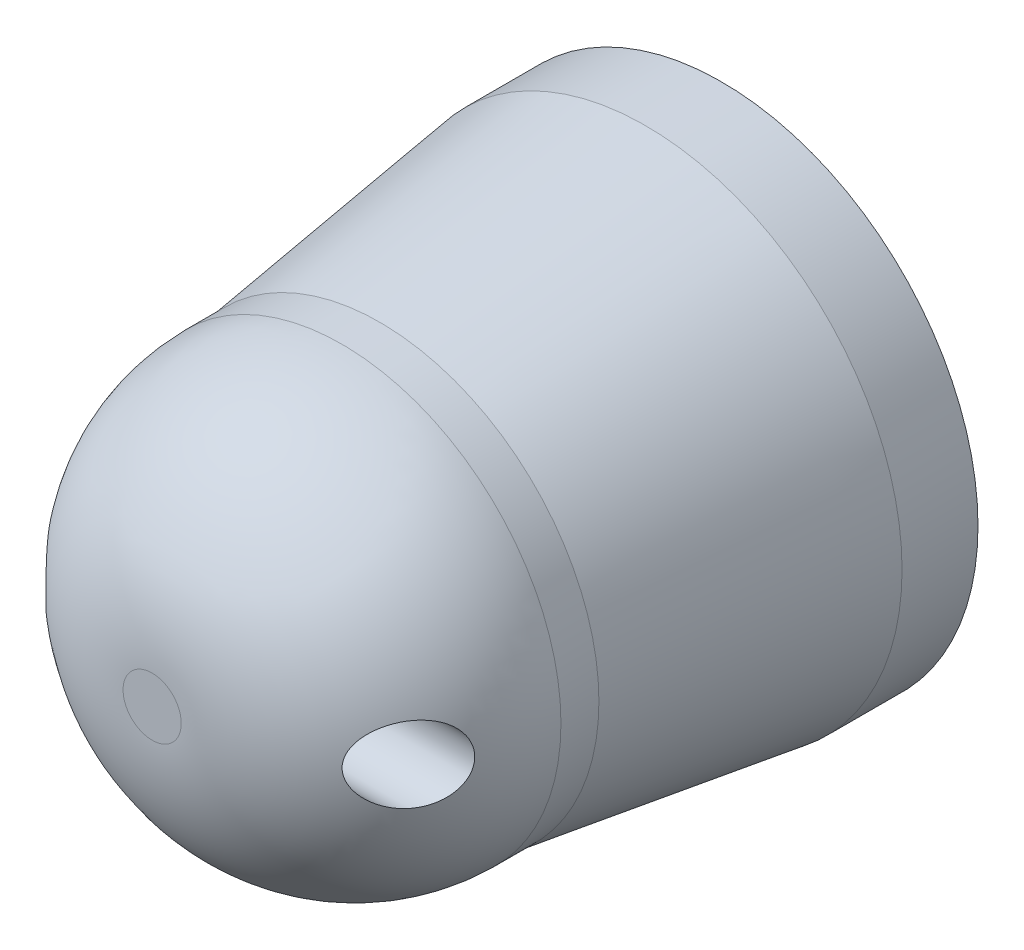
ISO-10303-21;
HEADER;
FILE_DESCRIPTION(('STEP AP214'),'2;1');
FILE_NAME('part.step','',(''),(''),'','','');
FILE_SCHEMA(('AUTOMOTIVE_DESIGN { 1 0 10303 214 1 1 1 1 }'));
ENDSEC;
DATA;
#1=APPLICATION_CONTEXT('core data for automotive mechanical design processes');
#2=APPLICATION_PROTOCOL_DEFINITION('international standard','automotive_design',2000,#1);
#3=PRODUCT_CONTEXT('',#1,'mechanical');
#4=PRODUCT('Part','Part','',(#3));
#5=PRODUCT_RELATED_PRODUCT_CATEGORY('part','',(#4));
#6=PRODUCT_DEFINITION_FORMATION('','',#4);
#7=PRODUCT_DEFINITION_CONTEXT('part definition',#1,'design');
#8=PRODUCT_DEFINITION('design','',#6,#7);
#9=PRODUCT_DEFINITION_SHAPE('','',#8);
#10=(LENGTH_UNIT() NAMED_UNIT(*) SI_UNIT(.MILLI.,.METRE.));
#11=(NAMED_UNIT(*) PLANE_ANGLE_UNIT() SI_UNIT($,.RADIAN.));
#12=(NAMED_UNIT(*) SI_UNIT($,.STERADIAN.) SOLID_ANGLE_UNIT());
#13=UNCERTAINTY_MEASURE_WITH_UNIT(LENGTH_MEASURE(1.E-05),#10,'distance_accuracy_value','');
#14=(GEOMETRIC_REPRESENTATION_CONTEXT(3) GLOBAL_UNCERTAINTY_ASSIGNED_CONTEXT((#13)) GLOBAL_UNIT_ASSIGNED_CONTEXT((#10,
#11,#12)) REPRESENTATION_CONTEXT('',''));
#15=CARTESIAN_POINT('',(0.,0.,0.));
#16=DIRECTION('',(0.,0.,1.));
#17=DIRECTION('',(1.,0.,0.));
#18=AXIS2_PLACEMENT_3D('',#15,#16,#17);
#19=CARTESIAN_POINT('',(0.,0.,-5.00000000000141));
#20=DIRECTION('',(0.,0.,1.));
#21=DIRECTION('',(1.,0.,0.));
#22=AXIS2_PLACEMENT_3D('',#19,#20,#21);
#23=DEGENERATE_TOROIDAL_SURFACE('',#22,0.766214157083196,5.,.T.);
#24=CARTESIAN_POINT('',(0.,0.,-1.41015809100517E-12));
#25=DIRECTION('',(0.,0.,1.));
#26=DIRECTION('',(1.,0.,0.));
#27=AXIS2_PLACEMENT_3D('',#24,#25,#26);
#28=CIRCLE('',#27,0.766214157083159);
#29=CARTESIAN_POINT('',(0.766214157083159,0.,-1.41015809100517E-12));
#30=VERTEX_POINT('',#29);
#31=EDGE_CURVE('E11',#30,#30,#28,.T.);
#32=ORIENTED_EDGE('',*,*,#31,.F.);
#33=EDGE_LOOP('',(#32));
#34=FACE_BOUND('',#33,.T.);
#35=CARTESIAN_POINT('',(0.,0.,-5.00000000000145));
#36=DIRECTION('',(0.,0.,1.));
#37=DIRECTION('',(1.,0.,0.));
#38=AXIS2_PLACEMENT_3D('',#35,#36,#37);
#39=CIRCLE('',#38,5.7662141570832);
#40=CARTESIAN_POINT('',(5.7662141570832,0.,-5.00000000000145));
#41=VERTEX_POINT('',#40);
#42=EDGE_CURVE('E57',#41,#41,#39,.T.);
#43=ORIENTED_EDGE('',*,*,#42,.T.);
#44=EDGE_LOOP('',(#43));
#45=FACE_BOUND('',#44,.T.);
#46=CARTESIAN_POINT('',(3.91551272438864,-0.181596850380828,-1.11987230926239));
#47=CARTESIAN_POINT('',(3.92464958219834,-0.232052576347552,-1.12919032917543));
#48=CARTESIAN_POINT('',(3.93745329032416,-0.28113390884847,-1.14229610931165));
#49=CARTESIAN_POINT('',(3.96894261741013,-0.375086726060637,-1.17491580366691));
#50=CARTESIAN_POINT('',(3.98763773472675,-0.419951259568574,-1.19444006822477));
#51=CARTESIAN_POINT('',(4.02915440916165,-0.504307011253518,-1.23842532676238));
#52=CARTESIAN_POINT('',(4.05192925883742,-0.543850990603123,-1.26283077253618));
#53=CARTESIAN_POINT('',(4.10052414868939,-0.617963056177003,-1.31572013503896));
#54=CARTESIAN_POINT('',(4.12634442595687,-0.652530754524231,-1.34420436934498));
#55=CARTESIAN_POINT('',(4.19389749641283,-0.733186687574791,-1.41996299808042));
#56=CARTESIAN_POINT('',(4.23700895794421,-0.776111928470118,-1.46939107303642));
#57=CARTESIAN_POINT('',(4.32587768552665,-0.850874149239611,-1.5739503598945));
#58=CARTESIAN_POINT('',(4.37163916150832,-0.882692888255067,-1.62909076271542));
#59=CARTESIAN_POINT('',(4.4648514932579,-0.935526914236205,-1.74428698053561));
#60=CARTESIAN_POINT('',(4.51231633664908,-0.956401746647023,-1.80439575649337));
#61=CARTESIAN_POINT('',(4.60717628427467,-0.986475802080964,-1.92751430143365));
#62=CARTESIAN_POINT('',(4.65457138356468,-0.995674233725975,-1.99052426674689));
#63=CARTESIAN_POINT('',(4.75313059880456,-1.00224980795107,-2.12462470586105));
#64=CARTESIAN_POINT('',(4.80417507015434,-0.998300311369112,-2.19587486396546));
#65=CARTESIAN_POINT('',(4.90346729239999,-0.97476347150355,-2.33775397725687));
#66=CARTESIAN_POINT('',(4.95171774113192,-0.955191492339454,-2.40838347387825));
#67=CARTESIAN_POINT('',(5.03311939194765,-0.906152158676146,-2.53001902544232));
#68=CARTESIAN_POINT('',(5.06717617963064,-0.880035033977753,-2.5817754218384));
#69=CARTESIAN_POINT('',(5.13185873401814,-0.817988317448195,-2.68146349903377));
#70=CARTESIAN_POINT('',(5.1624857698745,-0.782062372323847,-2.72939659271341));
#71=CARTESIAN_POINT('',(5.21955174567754,-0.700237229783592,-2.81977360855209));
#72=CARTESIAN_POINT('',(5.24595498963175,-0.654260081574043,-2.86217024055878));
#73=CARTESIAN_POINT('',(5.29312231899418,-0.553308072965033,-2.93861633171162));
#74=CARTESIAN_POINT('',(5.31389203861397,-0.49834229116812,-2.97267412736838));
#75=CARTESIAN_POINT('',(5.34614898526469,-0.389645829924935,-3.0259006058258));
#76=CARTESIAN_POINT('',(5.3585454122495,-0.336891363844607,-3.04651202470234));
#77=CARTESIAN_POINT('',(5.37780078982728,-0.227731520184067,-3.07862434344694));
#78=CARTESIAN_POINT('',(5.38466532161478,-0.171329884513418,-3.09013442554049));
#79=CARTESIAN_POINT('',(5.39200817254014,-0.0641928439132546,-3.10245291629684));
#80=CARTESIAN_POINT('',(5.39317994910689,-0.0136348596198455,-3.1044232756151));
#81=CARTESIAN_POINT('',(5.39097352621097,0.0870916245190146,-3.10071804297531));
#82=CARTESIAN_POINT('',(5.38759673173877,0.137260239821665,-3.0950448120161));
#83=CARTESIAN_POINT('',(5.37665768406311,0.233773984856216,-3.07672891437822));
#84=CARTESIAN_POINT('',(5.36926296837412,0.280191939069416,-3.06436529940116));
#85=CARTESIAN_POINT('',(5.3506827324677,0.370105068441291,-3.03345138567398));
#86=CARTESIAN_POINT('',(5.33949678920689,0.413599916776476,-3.01490039651062));
#87=CARTESIAN_POINT('',(5.31311002297553,0.498658279157996,-2.97141888597494));
#88=CARTESIAN_POINT('',(5.29774844299611,0.540041428898376,-2.94623456380394));
#89=CARTESIAN_POINT('',(5.26375825408568,0.61788401526582,-2.89096421017212));
#90=CARTESIAN_POINT('',(5.24512847526049,0.654341680451569,-2.86087642372743));
#91=CARTESIAN_POINT('',(5.20288000265725,0.72561006776314,-2.79328804078525));
#92=CARTESIAN_POINT('',(5.17893807031974,0.759799806059739,-2.7553362061633));
#93=CARTESIAN_POINT('',(5.12824159672882,0.821315494844422,-2.67592978961033));
#94=CARTESIAN_POINT('',(5.101485655601,0.848638005990838,-2.63447346634599));
#95=CARTESIAN_POINT('',(5.04153814557387,0.899969144545144,-2.54280367271123));
#96=CARTESIAN_POINT('',(5.00798274269226,0.922869555542728,-2.49220824269589));
#97=CARTESIAN_POINT('',(4.93863076908344,0.959757428413421,-2.38934964487398));
#98=CARTESIAN_POINT('',(4.90283302670779,0.973740187319699,-2.33708561231489));
#99=CARTESIAN_POINT('',(4.82379766130931,0.994644577473659,-2.22371222728919));
#100=CARTESIAN_POINT('',(4.78028386700545,1.00008485332095,-2.16252123574102));
#101=CARTESIAN_POINT('',(4.6920061548602,0.999913007285519,-2.04104297157383));
#102=CARTESIAN_POINT('',(4.64724129702911,0.994292341968491,-1.9807564337933));
#103=CARTESIAN_POINT('',(4.55167138774703,0.97104691792896,-1.85492496645013));
#104=CARTESIAN_POINT('',(4.50081741921579,0.951995933976108,-1.78967735504654));
#105=CARTESIAN_POINT('',(4.40003953567115,0.900793954103438,-1.66370673732055));
#106=CARTESIAN_POINT('',(4.35011567018882,0.868642262601006,-1.60298397144755));
#107=CARTESIAN_POINT('',(4.26136236457079,0.797942932683092,-1.49777915782112));
#108=CARTESIAN_POINT('',(4.22209611504997,0.761430641799014,-1.45229593062562));
#109=CARTESIAN_POINT('',(4.14696885446376,0.679335300747038,-1.36704178773326));
#110=CARTESIAN_POINT('',(4.11110278483506,0.633766047953034,-1.32726233966233));
#111=CARTESIAN_POINT('',(4.05346372306417,0.546421221035608,-1.26448080580738));
#112=CARTESIAN_POINT('',(4.03043870628137,0.506684891433534,-1.23979515782175));
#113=CARTESIAN_POINT('',(3.98871308457407,0.422355722558621,-1.19557064807802));
#114=CARTESIAN_POINT('',(3.97000639943102,0.377769843297826,-1.17602454436958));
#115=CARTESIAN_POINT('',(3.94117489475664,0.292613265464853,-1.14614603209781));
#116=CARTESIAN_POINT('',(3.93011884759828,0.25271861342167,-1.13479714894787));
#117=CARTESIAN_POINT('',(3.9127679053576,0.170839803400439,-1.11705852447406));
#118=CARTESIAN_POINT('',(3.90646943207423,0.128857241133992,-1.11066505605713));
#119=CARTESIAN_POINT('',(3.8990237768751,0.0417127929966873,-1.10311134045884));
#120=CARTESIAN_POINT('',(3.89816362503249,-0.00350045560364973,-1.10224267427866));
#121=CARTESIAN_POINT('',(3.90245773199322,-0.0933505706559028,-1.10659447880612));
#122=CARTESIAN_POINT('',(3.90761557718667,-0.13798707736686,-1.11181858046231));
#123=CARTESIAN_POINT('',(3.91551272438864,-0.181596850380828,-1.11987230926239));
#124=B_SPLINE_CURVE_WITH_KNOTS('',3,(#46,#47,#48,#49,#50,#51,#52,#53,#54,#55,#56,#57,#58,#59,
#60,#61,#62,#63,#64,#65,#66,#67,#68,#69,#70,#71,#72,#73,#74,#75,#76,#77,#78,#79,#80,#81,#82,#83,
#84,#85,#86,#87,#88,#89,#90,#91,#92,#93,#94,#95,#96,#97,#98,#99,#100,#101,#102,#103,#104,#105,
#106,#107,#108,#109,#110,#111,#112,#113,#114,#115,#116,#117,#118,#119,#120,#121,#122,#123),
.UNSPECIFIED.,.T.,.F.,(4,2,2,2,2,2,2,2,2,2,2,2,2,2,2,2,2,2,2,2,2,2,2,2,2,2,2,2,2,2,2,2,2,2,2,2,
2,2,4),(0.,0.156120278331717,0.312493558736575,0.467179343790239,0.621877179332349,
0.855778970080472,1.09006312366256,1.32728471017928,1.56452237373495,1.82639362416755,
2.08800765099445,2.28891260414643,2.48974296666004,2.69218988968779,2.89443358821342,
3.06735679698028,3.24010532228277,3.39116998694618,3.54218800052958,3.68734454053628,
3.83251728314218,3.98435543153194,4.13624804367788,4.30482813020148,4.47349247989338,
4.66740335993518,4.86141641978315,5.08636413285264,5.31148566298706,5.56503509399123,
5.81859798896757,6.02877986529623,6.23864397150079,6.39452580916921,6.55018680770701,
6.67842980852656,6.80657626068162,6.94143335981401,7.07637086731145),.UNSPECIFIED.);
#125=CARTESIAN_POINT('',(3.91551272438864,-0.181596850380828,-1.11987230926239));
#126=VERTEX_POINT('',#125);
#127=EDGE_CURVE('E86',#126,#126,#124,.T.);
#128=ORIENTED_EDGE('',*,*,#127,.F.);
#129=EDGE_LOOP('',(#128));
#130=FACE_BOUND('',#129,.T.);
#131=CARTESIAN_POINT('',(-5.24198639971323,-0.658395880390246,-2.85591737944631));
#132=CARTESIAN_POINT('',(-5.21690237769717,-0.704494715094463,-2.81558933806743));
#133=CARTESIAN_POINT('',(-5.18931144880955,-0.74612352907558,-2.77167779939897));
#134=CARTESIAN_POINT('',(-5.13014906680513,-0.819888440939242,-2.67884129971001));
#135=CARTESIAN_POINT('',(-5.09857209957124,-0.852011178600024,-2.62990941165133));
#136=CARTESIAN_POINT('',(-5.03257717636381,-0.906523270691957,-2.52923905587878));
#137=CARTESIAN_POINT('',(-4.99817847559906,-0.92897296901005,-2.47752032132827));
#138=CARTESIAN_POINT('',(-4.92715290443993,-0.964657710568012,-2.37252527893781));
#139=CARTESIAN_POINT('',(-4.89052645878891,-0.977894504395413,-2.31924926900893));
#140=CARTESIAN_POINT('',(-4.81015850424683,-0.996807707936884,-2.20444039236183));
#141=CARTESIAN_POINT('',(-4.76616567138344,-1.00107697017665,-2.14285133849897));
#142=CARTESIAN_POINT('',(-4.67700168923358,-0.998462730751191,-2.02073261496012));
#143=CARTESIAN_POINT('',(-4.63182947353697,-0.991568765502057,-1.96020399302104));
#144=CARTESIAN_POINT('',(-4.53562848261413,-0.965533596953492,-1.83421074423376));
#145=CARTESIAN_POINT('',(-4.48456540061573,-0.944985007434937,-1.76905971921438));
#146=CARTESIAN_POINT('',(-4.38355260174766,-0.89068960085531,-1.64351747095817));
#147=CARTESIAN_POINT('',(-4.33360278935498,-0.856943920801923,-1.58312583820988));
#148=CARTESIAN_POINT('',(-4.24598534318867,-0.783981684738796,-1.47988824438433));
#149=CARTESIAN_POINT('',(-4.2077887497831,-0.747026813157477,-1.43588992711651));
#150=CARTESIAN_POINT('',(-4.13488392120522,-0.664365149918707,-1.35357126724126));
#151=CARTESIAN_POINT('',(-4.10017038219015,-0.61867198267333,-1.315242248135));
#152=CARTESIAN_POINT('',(-4.04447957186805,-0.531251976991193,-1.25481532266474));
#153=CARTESIAN_POINT('',(-4.02225274752858,-0.49146504023984,-1.23106744916549));
#154=CARTESIAN_POINT('',(-3.98216287385508,-0.407216911217147,-1.18870262311434));
#155=CARTESIAN_POINT('',(-3.96429377924404,-0.362762318143163,-1.17007855788799));
#156=CARTESIAN_POINT('',(-3.93689863038335,-0.277790645329436,-1.14174559233597));
#157=CARTESIAN_POINT('',(-3.92646950268263,-0.237894745809948,-1.13105801233812));
#158=CARTESIAN_POINT('',(-3.91038735779462,-0.156161496605778,-1.11463705882081));
#159=CARTESIAN_POINT('',(-3.90473069694564,-0.114325653812925,-1.10889990569529));
#160=CARTESIAN_POINT('',(-3.89870039279673,-0.029725181098875,-1.10278524406755));
#161=CARTESIAN_POINT('',(-3.89834549080874,0.0130422087188751,-1.10242674868961));
#162=CARTESIAN_POINT('',(-3.9030034981587,0.0979786582364521,-1.10714778434644));
#163=CARTESIAN_POINT('',(-3.90801750361966,0.140147593973839,-1.11222842584229));
#164=CARTESIAN_POINT('',(-3.92255435718664,0.220538056262535,-1.12705361170132));
#165=CARTESIAN_POINT('',(-3.93183535104621,0.258851297346071,-1.13654825712624));
#166=CARTESIAN_POINT('',(-3.95413425650728,0.333093577392365,-1.15954952876703));
#167=CARTESIAN_POINT('',(-3.96715388221183,0.369021513406835,-1.17305799535482));
#168=CARTESIAN_POINT('',(-4.00255010354744,0.453126427439144,-1.21015489379858));
#169=CARTESIAN_POINT('',(-4.02653231829815,0.499823417993634,-1.23557110092858));
#170=CARTESIAN_POINT('',(-4.07885505932987,0.587005149692982,-1.2919903109494));
#171=CARTESIAN_POINT('',(-4.10720544772145,0.627475408797004,-1.32300598377143));
#172=CARTESIAN_POINT('',(-4.17627167956522,0.71396527533812,-1.39997990633698));
#173=CARTESIAN_POINT('',(-4.21806020031601,0.75768341952604,-1.44755967482659));
#174=CARTESIAN_POINT('',(-4.30441874287632,0.834374097536968,-1.54841346965963));
#175=CARTESIAN_POINT('',(-4.3489903336528,0.867340503654967,-1.60169072026478));
#176=CARTESIAN_POINT('',(-4.4401451104704,0.923025263260758,-1.71340151939811));
#177=CARTESIAN_POINT('',(-4.48674912796413,0.945570113759509,-1.77190426340998));
#178=CARTESIAN_POINT('',(-4.58009786697488,0.97941802670822,-1.89198104761208));
#179=CARTESIAN_POINT('',(-4.62684262577641,0.990717787507724,-1.95355598425392));
#180=CARTESIAN_POINT('',(-4.72503741685018,1.00231132447035,-2.08592724493));
#181=CARTESIAN_POINT('',(-4.77637783649678,1.00111930775162,-2.15694249947711));
#182=CARTESIAN_POINT('',(-4.8765378723104,0.983285028349151,-2.29882610252821));
#183=CARTESIAN_POINT('',(-4.9253595813173,0.966655818287753,-2.36969452445473));
#184=CARTESIAN_POINT('',(-5.00878714307667,0.922563846032096,-2.49338002002239));
#185=CARTESIAN_POINT('',(-5.04418207129001,0.898226710026782,-2.54678294809184));
#186=CARTESIAN_POINT('',(-5.11161572583334,0.839371968595222,-2.65003644959743));
#187=CARTESIAN_POINT('',(-5.14365556428998,0.80485775117978,-2.6998881983958));
#188=CARTESIAN_POINT('',(-5.20360818865504,0.725406688350523,-2.79434902446843));
#189=CARTESIAN_POINT('',(-5.23148512353836,0.68038700576204,-2.83891194888447));
#190=CARTESIAN_POINT('',(-5.28159430441244,0.580784214340542,-2.91981820686921));
#191=CARTESIAN_POINT('',(-5.30383238463177,0.526211089626491,-2.95617003174511));
#192=CARTESIAN_POINT('',(-5.33868089687348,0.417817517480901,-3.01352921478629));
#193=CARTESIAN_POINT('',(-5.35222867132764,0.365078788481868,-3.03601063127373));
#194=CARTESIAN_POINT('',(-5.37369964864629,0.25550025608835,-3.07176433270178));
#195=CARTESIAN_POINT('',(-5.38162898362621,0.198664998657407,-3.08504665741933));
#196=CARTESIAN_POINT('',(-5.39079325855878,0.0907230488912814,-3.10041163444028));
#197=CARTESIAN_POINT('',(-5.39277527330347,0.0398536680815642,-3.10374384637322));
#198=CARTESIAN_POINT('',(-5.39211029722192,-0.0617626623379855,-3.10262689703253));
#199=CARTESIAN_POINT('',(-5.38946482437993,-0.112509646630281,-3.09818028749526));
#200=CARTESIAN_POINT('',(-5.37989284956222,-0.209973609778404,-3.08214171534877));
#201=CARTESIAN_POINT('',(-5.3731714899371,-0.256768201949131,-3.0708922179555));
#202=CARTESIAN_POINT('',(-5.3558856634877,-0.347610991545026,-3.04209421283409));
#203=CARTESIAN_POINT('',(-5.34532147851632,-0.391659390112901,-3.02454616707566));
#204=CARTESIAN_POINT('',(-5.32094050631772,-0.475250349440772,-2.98429533763131));
#205=CARTESIAN_POINT('',(-5.30718900651938,-0.514862366815952,-2.96169630994013));
#206=CARTESIAN_POINT('',(-5.27671895131244,-0.589884515305668,-2.91198798637081));
#207=CARTESIAN_POINT('',(-5.25999902576818,-0.625292693406746,-2.88487660809079));
#208=CARTESIAN_POINT('',(-5.24198639971323,-0.658395880390246,-2.85591737944631));
#209=B_SPLINE_CURVE_WITH_KNOTS('',3,(#131,#132,#133,#134,#135,#136,#137,#138,#139,#140,#141,
#142,#143,#144,#145,#146,#147,#148,#149,#150,#151,#152,#153,#154,#155,#156,#157,#158,#159,#160,
#161,#162,#163,#164,#165,#166,#167,#168,#169,#170,#171,#172,#173,#174,#175,#176,#177,#178,#179,
#180,#181,#182,#183,#184,#185,#186,#187,#188,#189,#190,#191,#192,#193,#194,#195,#196,#197,#198,
#199,#200,#201,#202,#203,#204,#205,#206,#207,#208),.UNSPECIFIED.,.T.,.F.,(4,2,2,2,2,2,2,2,2,2,2,
2,2,2,2,2,2,2,2,2,2,2,2,2,2,2,2,2,2,2,2,2,2,2,2,2,2,2,4),(0.,0.198360575823317,
0.396998625806539,0.594378898793185,0.791721656374423,1.01824142658663,1.24497364261111,
1.49970730454639,1.75441902449791,1.96067986251512,2.16662169059975,2.32026062074844,
2.47368518655826,2.60094785471318,2.72811327278276,2.85572810493076,2.98336899605451,
3.10452914603154,3.22574493494123,3.39975238894798,3.57415862075049,3.80379774134969,
4.03356751168581,4.26703584635631,4.50057270903612,4.76217413553341,5.02355457123867,
5.22833579936298,5.43304893142084,5.63943432245932,5.84560529789629,6.02129317278762,
6.1967890006244,6.3490592546255,6.50127956781144,6.64640972305182,6.79152923583391,
6.93390441571301,7.07634548334012),.UNSPECIFIED.);
#210=CARTESIAN_POINT('',(-5.24198639971323,-0.658395880390246,-2.85591737944631));
#211=VERTEX_POINT('',#210);
#212=EDGE_CURVE('E49',#211,#211,#209,.T.);
#213=ORIENTED_EDGE('',*,*,#212,.F.);
#214=EDGE_LOOP('',(#213));
#215=FACE_BOUND('',#214,.T.);
#216=ADVANCED_FACE('F45',(#34,#45,#130,#215),#23,.T.);
#217=CARTESIAN_POINT('',(0.,0.,-1.41020500809091E-12));
#218=DIRECTION('',(0.,0.,-1.));
#219=DIRECTION('',(-1.,0.,0.));
#220=AXIS2_PLACEMENT_3D('',#217,#218,#219);
#221=PLANE('',#220);
#222=ORIENTED_EDGE('',*,*,#31,.T.);
#223=EDGE_LOOP('',(#222));
#224=FACE_BOUND('',#223,.T.);
#225=ADVANCED_FACE('F47',(#224),#221,.F.);
#226=CARTESIAN_POINT('',(0.,0.,0.));
#227=DIRECTION('',(0.,0.,1.));
#228=DIRECTION('',(1.,0.,0.));
#229=AXIS2_PLACEMENT_3D('',#226,#227,#228);
#230=CYLINDRICAL_SURFACE('',#229,5.7662141570832);
#231=ORIENTED_EDGE('',*,*,#42,.F.);
#232=EDGE_LOOP('',(#231));
#233=FACE_BOUND('',#232,.T.);
#234=CARTESIAN_POINT('',(0.,0.,-6.));
#235=DIRECTION('',(0.,0.,1.));
#236=DIRECTION('',(1.,0.,0.));
#237=AXIS2_PLACEMENT_3D('',#234,#235,#236);
#238=CIRCLE('',#237,5.7662141570832);
#239=CARTESIAN_POINT('',(5.7662141570832,0.,-6.));
#240=VERTEX_POINT('',#239);
#241=EDGE_CURVE('E82',#240,#240,#238,.T.);
#242=ORIENTED_EDGE('',*,*,#241,.T.);
#243=EDGE_LOOP('',(#242));
#244=FACE_BOUND('',#243,.T.);
#245=ADVANCED_FACE('F110',(#233,#244),#230,.T.);
#246=CARTESIAN_POINT('',(0.,0.,-12.9999999999999));
#247=DIRECTION('',(0.,0.,-1.));
#248=DIRECTION('',(-1.,0.,0.));
#249=AXIS2_PLACEMENT_3D('',#246,#247,#248);
#250=CONICAL_SURFACE('',#249,6.75,0.139626340159557);
#251=ORIENTED_EDGE('',*,*,#241,.F.);
#252=EDGE_LOOP('',(#251));
#253=FACE_BOUND('',#252,.T.);
#254=CARTESIAN_POINT('',(0.,0.,-12.9999999999999));
#255=DIRECTION('',(0.,0.,1.));
#256=DIRECTION('',(1.,0.,0.));
#257=AXIS2_PLACEMENT_3D('',#254,#255,#256);
#258=CIRCLE('',#257,6.75);
#259=CARTESIAN_POINT('',(6.75,0.,-12.9999999999999));
#260=VERTEX_POINT('',#259);
#261=EDGE_CURVE('E75',#260,#260,#258,.T.);
#262=ORIENTED_EDGE('',*,*,#261,.T.);
#263=EDGE_LOOP('',(#262));
#264=FACE_BOUND('',#263,.T.);
#265=ADVANCED_FACE('F107',(#253,#264),#250,.T.);
#266=CARTESIAN_POINT('',(0.,0.,0.));
#267=DIRECTION('',(0.,0.,1.));
#268=DIRECTION('',(1.,0.,0.));
#269=AXIS2_PLACEMENT_3D('',#266,#267,#268);
#270=CYLINDRICAL_SURFACE('',#269,6.75);
#271=ORIENTED_EDGE('',*,*,#261,.F.);
#272=EDGE_LOOP('',(#271));
#273=FACE_BOUND('',#272,.T.);
#274=CARTESIAN_POINT('',(0.,0.,-14.9999999999999));
#275=DIRECTION('',(0.,0.,1.));
#276=DIRECTION('',(1.,0.,0.));
#277=AXIS2_PLACEMENT_3D('',#274,#275,#276);
#278=CIRCLE('',#277,6.75);
#279=CARTESIAN_POINT('',(6.75,0.,-14.9999999999999));
#280=VERTEX_POINT('',#279);
#281=EDGE_CURVE('E71',#280,#280,#278,.T.);
#282=ORIENTED_EDGE('',*,*,#281,.T.);
#283=EDGE_LOOP('',(#282));
#284=FACE_BOUND('',#283,.T.);
#285=ADVANCED_FACE('F103',(#273,#284),#270,.T.);
#286=CARTESIAN_POINT('',(0.,0.,-14.9999999999999));
#287=DIRECTION('',(0.,0.,1.));
#288=DIRECTION('',(1.,0.,0.));
#289=AXIS2_PLACEMENT_3D('',#286,#287,#288);
#290=PLANE('',#289);
#291=CARTESIAN_POINT('',(0.,0.,-14.9999999999999));
#292=DIRECTION('',(0.,0.,-1.));
#293=DIRECTION('',(-1.,0.,0.));
#294=AXIS2_PLACEMENT_3D('',#291,#292,#293);
#295=CIRCLE('',#294,3.);
#296=CARTESIAN_POINT('',(-3.,0.,-14.9999999999999));
#297=VERTEX_POINT('',#296);
#298=EDGE_CURVE('E72',#297,#297,#295,.T.);
#299=ORIENTED_EDGE('',*,*,#298,.F.);
#300=EDGE_LOOP('',(#299));
#301=FACE_BOUND('',#300,.T.);
#302=ORIENTED_EDGE('',*,*,#281,.F.);
#303=EDGE_LOOP('',(#302));
#304=FACE_BOUND('',#303,.T.);
#305=ADVANCED_FACE('F65',(#301,#304),#290,.F.);
#306=CARTESIAN_POINT('',(0.,0.,-5.9999999999999));
#307=DIRECTION('',(0.,0.,-1.));
#308=DIRECTION('',(-1.,0.,0.));
#309=AXIS2_PLACEMENT_3D('',#306,#307,#308);
#310=CONICAL_SURFACE('',#309,3.,1.02974425867665);
#311=CARTESIAN_POINT('',(0.,0.,-4.19741814291722));
#312=VERTEX_POINT('',#311);
#313=VERTEX_LOOP('',#312);
#314=FACE_BOUND('',#313,.T.);
#315=CARTESIAN_POINT('',(0.,0.,-5.9999999999999));
#316=DIRECTION('',(0.,0.,-1.));
#317=DIRECTION('',(-1.,0.,0.));
#318=AXIS2_PLACEMENT_3D('',#315,#316,#317);
#319=CIRCLE('',#318,3.);
#320=CARTESIAN_POINT('',(-3.,0.,-5.9999999999999));
#321=VERTEX_POINT('',#320);
#322=EDGE_CURVE('E69',#321,#321,#319,.T.);
#323=ORIENTED_EDGE('',*,*,#322,.T.);
#324=EDGE_LOOP('',(#323));
#325=FACE_BOUND('',#324,.T.);
#326=ADVANCED_FACE('F61',(#314,#325),#310,.F.);
#327=CARTESIAN_POINT('',(0.,0.,-14.9999999999999));
#328=DIRECTION('',(0.,0.,-1.));
#329=DIRECTION('',(-1.,0.,0.));
#330=AXIS2_PLACEMENT_3D('',#327,#328,#329);
#331=CYLINDRICAL_SURFACE('',#330,3.);
#332=ORIENTED_EDGE('',*,*,#322,.F.);
#333=EDGE_LOOP('',(#332));
#334=FACE_BOUND('',#333,.T.);
#335=ORIENTED_EDGE('',*,*,#298,.T.);
#336=EDGE_LOOP('',(#335));
#337=FACE_BOUND('',#336,.T.);
#338=ADVANCED_FACE('F64',(#334,#337),#331,.F.);
#339=CARTESIAN_POINT('',(10.,0.,-2.10324537373577));
#340=DIRECTION('',(-1.,0.,0.));
#341=DIRECTION('',(0.,0.,1.));
#342=AXIS2_PLACEMENT_3D('',#339,#340,#341);
#343=CYLINDRICAL_SURFACE('',#342,1.);
#344=ORIENTED_EDGE('',*,*,#127,.T.);
#345=EDGE_LOOP('',(#344));
#346=FACE_BOUND('',#345,.T.);
#347=ORIENTED_EDGE('',*,*,#212,.T.);
#348=EDGE_LOOP('',(#347));
#349=FACE_BOUND('',#348,.T.);
#350=ADVANCED_FACE('F93',(#346,#349),#343,.F.);
#351=CLOSED_SHELL('',(#216,#225,#245,#265,#285,#305,#326,#338,#350));
#352=MANIFOLD_SOLID_BREP('B2',#351);
#353=ADVANCED_BREP_SHAPE_REPRESENTATION('',(#18,#352),#14);
#354=SHAPE_DEFINITION_REPRESENTATION(#9,#353);
ENDSEC;
END-ISO-10303-21;
